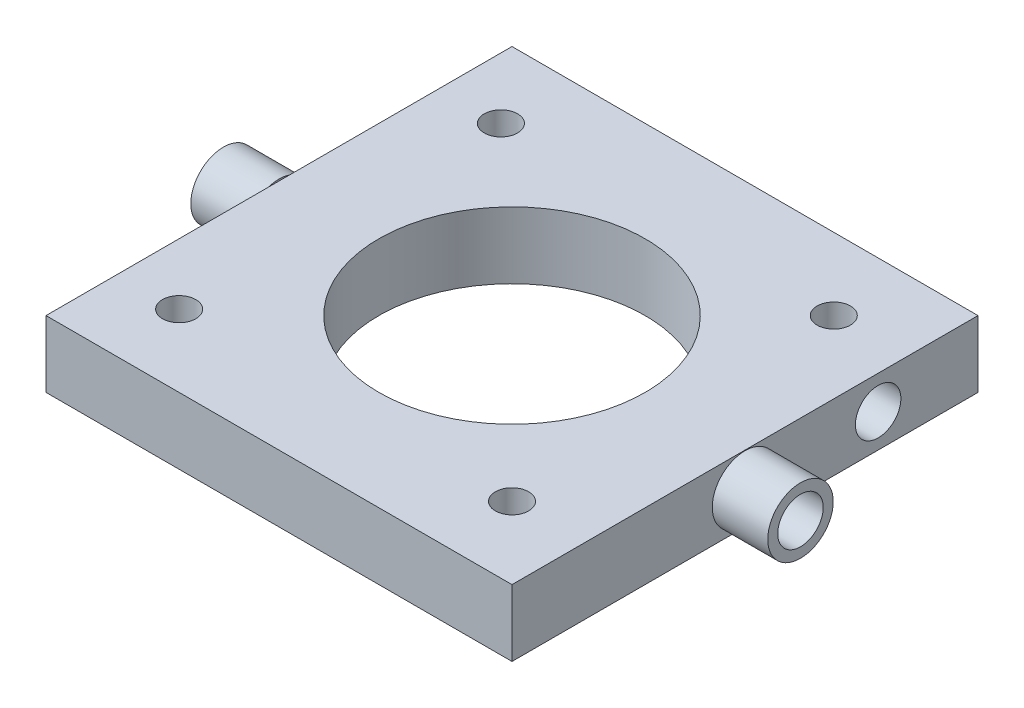
ISO-10303-21;
HEADER;
FILE_DESCRIPTION(('STEP AP214'),'2;1');
FILE_NAME('part.step','',(''),(''),'','','');
FILE_SCHEMA(('AUTOMOTIVE_DESIGN { 1 0 10303 214 1 1 1 1 }'));
ENDSEC;
DATA;
#1=APPLICATION_CONTEXT('core data for automotive mechanical design processes');
#2=APPLICATION_PROTOCOL_DEFINITION('international standard','automotive_design',2000,#1);
#3=PRODUCT_CONTEXT('',#1,'mechanical');
#4=PRODUCT('Part','Part','',(#3));
#5=PRODUCT_RELATED_PRODUCT_CATEGORY('part','',(#4));
#6=PRODUCT_DEFINITION_FORMATION('','',#4);
#7=PRODUCT_DEFINITION_CONTEXT('part definition',#1,'design');
#8=PRODUCT_DEFINITION('design','',#6,#7);
#9=PRODUCT_DEFINITION_SHAPE('','',#8);
#10=(LENGTH_UNIT() NAMED_UNIT(*) SI_UNIT(.MILLI.,.METRE.));
#11=(NAMED_UNIT(*) PLANE_ANGLE_UNIT() SI_UNIT($,.RADIAN.));
#12=(NAMED_UNIT(*) SI_UNIT($,.STERADIAN.) SOLID_ANGLE_UNIT());
#13=UNCERTAINTY_MEASURE_WITH_UNIT(LENGTH_MEASURE(1.E-05),#10,'distance_accuracy_value','');
#14=(GEOMETRIC_REPRESENTATION_CONTEXT(3) GLOBAL_UNCERTAINTY_ASSIGNED_CONTEXT((#13)) GLOBAL_UNIT_ASSIGNED_CONTEXT((#10,
#11,#12)) REPRESENTATION_CONTEXT('',''));
#15=CARTESIAN_POINT('',(0.,0.,0.));
#16=DIRECTION('',(0.,0.,1.));
#17=DIRECTION('',(1.,0.,0.));
#18=AXIS2_PLACEMENT_3D('',#15,#16,#17);
#19=CARTESIAN_POINT('',(21.,6.,21.));
#20=DIRECTION('',(-1.,0.,0.));
#21=DIRECTION('',(0.,0.,1.));
#22=AXIS2_PLACEMENT_3D('',#19,#20,#21);
#23=PLANE('',#22);
#24=DIRECTION('',(0.,0.,-1.));
#25=VECTOR('',#24,1.);
#26=CARTESIAN_POINT('',(21.,0.,21.));
#27=LINE('',#26,#25);
#28=CARTESIAN_POINT('',(21.,0.,21.));
#29=VERTEX_POINT('',#28);
#30=CARTESIAN_POINT('',(21.,0.,-21.));
#31=VERTEX_POINT('',#30);
#32=EDGE_CURVE('E166',#29,#31,#27,.T.);
#33=ORIENTED_EDGE('',*,*,#32,.T.);
#34=DIRECTION('',(0.,-1.,0.));
#35=VECTOR('',#34,1.);
#36=CARTESIAN_POINT('',(21.,6.,-21.));
#37=LINE('',#36,#35);
#38=CARTESIAN_POINT('',(21.,6.,-21.));
#39=VERTEX_POINT('',#38);
#40=EDGE_CURVE('E185',#39,#31,#37,.T.);
#41=ORIENTED_EDGE('',*,*,#40,.F.);
#42=DIRECTION('',(0.,0.,-1.));
#43=VECTOR('',#42,1.);
#44=CARTESIAN_POINT('',(21.,6.,21.));
#45=LINE('',#44,#43);
#46=CARTESIAN_POINT('',(21.,6.,21.));
#47=VERTEX_POINT('',#46);
#48=EDGE_CURVE('E169',#47,#39,#45,.T.);
#49=ORIENTED_EDGE('',*,*,#48,.F.);
#50=DIRECTION('',(0.,-1.,0.));
#51=VECTOR('',#50,1.);
#52=CARTESIAN_POINT('',(21.,6.,21.));
#53=LINE('',#52,#51);
#54=EDGE_CURVE('E173',#47,#29,#53,.T.);
#55=ORIENTED_EDGE('',*,*,#54,.T.);
#56=EDGE_LOOP('',(#33,#41,#49,#55));
#57=FACE_BOUND('',#56,.T.);
#58=CARTESIAN_POINT('',(21.,3.,-12.));
#59=DIRECTION('',(1.,0.,0.));
#60=DIRECTION('',(0.,0.,-1.));
#61=AXIS2_PLACEMENT_3D('',#58,#59,#60);
#62=CIRCLE('',#61,2.05);
#63=CARTESIAN_POINT('',(21.,3.,-14.05));
#64=VERTEX_POINT('',#63);
#65=EDGE_CURVE('E134',#64,#64,#62,.T.);
#66=ORIENTED_EDGE('',*,*,#65,.F.);
#67=EDGE_LOOP('',(#66));
#68=FACE_BOUND('',#67,.T.);
#69=CARTESIAN_POINT('',(21.,3.,0.));
#70=DIRECTION('',(-1.,0.,0.));
#71=DIRECTION('',(0.,0.,1.));
#72=AXIS2_PLACEMENT_3D('',#69,#70,#71);
#73=CIRCLE('',#72,2.95);
#74=CARTESIAN_POINT('',(21.,3.,2.94999999999999));
#75=VERTEX_POINT('',#74);
#76=EDGE_CURVE('E39',#75,#75,#73,.F.);
#77=ORIENTED_EDGE('',*,*,#76,.F.);
#78=EDGE_LOOP('',(#77));
#79=FACE_BOUND('',#78,.T.);
#80=ADVANCED_FACE('F36',(#57,#68,#79),#23,.F.);
#81=CARTESIAN_POINT('',(-21.,6.,-21.));
#82=DIRECTION('',(0.,0.,1.));
#83=DIRECTION('',(1.,0.,0.));
#84=AXIS2_PLACEMENT_3D('',#81,#82,#83);
#85=PLANE('',#84);
#86=DIRECTION('',(-1.,0.,0.));
#87=VECTOR('',#86,1.);
#88=CARTESIAN_POINT('',(-21.,0.,-21.));
#89=LINE('',#88,#87);
#90=CARTESIAN_POINT('',(-21.,0.,-21.));
#91=VERTEX_POINT('',#90);
#92=EDGE_CURVE('E176',#31,#91,#89,.T.);
#93=ORIENTED_EDGE('',*,*,#92,.T.);
#94=DIRECTION('',(0.,-1.,0.));
#95=VECTOR('',#94,1.);
#96=CARTESIAN_POINT('',(-21.,6.,-21.));
#97=LINE('',#96,#95);
#98=CARTESIAN_POINT('',(-21.,6.,-21.));
#99=VERTEX_POINT('',#98);
#100=EDGE_CURVE('E183',#99,#91,#97,.T.);
#101=ORIENTED_EDGE('',*,*,#100,.F.);
#102=DIRECTION('',(-1.,0.,0.));
#103=VECTOR('',#102,1.);
#104=CARTESIAN_POINT('',(-21.,6.,-21.));
#105=LINE('',#104,#103);
#106=EDGE_CURVE('E88',#39,#99,#105,.T.);
#107=ORIENTED_EDGE('',*,*,#106,.F.);
#108=ORIENTED_EDGE('',*,*,#40,.T.);
#109=EDGE_LOOP('',(#93,#101,#107,#108));
#110=FACE_BOUND('',#109,.T.);
#111=ADVANCED_FACE('F193',(#110),#85,.F.);
#112=CARTESIAN_POINT('',(-21.,6.,21.));
#113=DIRECTION('',(1.,0.,0.));
#114=DIRECTION('',(0.,0.,-1.));
#115=AXIS2_PLACEMENT_3D('',#112,#113,#114);
#116=PLANE('',#115);
#117=CARTESIAN_POINT('',(-21.,3.20690884142825,0.));
#118=DIRECTION('',(-1.,0.,0.));
#119=DIRECTION('',(0.,0.,1.));
#120=AXIS2_PLACEMENT_3D('',#117,#118,#119);
#121=CIRCLE('',#120,2.95);
#122=CARTESIAN_POINT('',(-21.,6.,-0.949284878162673));
#123=VERTEX_POINT('',#122);
#124=CARTESIAN_POINT('',(-21.,6.,0.949284878162649));
#125=VERTEX_POINT('',#124);
#126=EDGE_CURVE('E11',#123,#125,#121,.T.);
#127=ORIENTED_EDGE('',*,*,#126,.F.);
#128=DIRECTION('',(0.,0.,1.));
#129=VECTOR('',#128,1.);
#130=CARTESIAN_POINT('',(-21.,6.,21.));
#131=LINE('',#130,#129);
#132=EDGE_CURVE('E96',#99,#123,#131,.T.);
#133=ORIENTED_EDGE('',*,*,#132,.F.);
#134=ORIENTED_EDGE('',*,*,#100,.T.);
#135=DIRECTION('',(0.,0.,1.));
#136=VECTOR('',#135,1.);
#137=CARTESIAN_POINT('',(-21.,0.,21.));
#138=LINE('',#137,#136);
#139=CARTESIAN_POINT('',(-21.,0.,21.));
#140=VERTEX_POINT('',#139);
#141=EDGE_CURVE('E178',#91,#140,#138,.T.);
#142=ORIENTED_EDGE('',*,*,#141,.T.);
#143=DIRECTION('',(0.,-1.,0.));
#144=VECTOR('',#143,1.);
#145=CARTESIAN_POINT('',(-21.,6.,21.));
#146=LINE('',#145,#144);
#147=CARTESIAN_POINT('',(-21.,6.,21.));
#148=VERTEX_POINT('',#147);
#149=EDGE_CURVE('E103',#148,#140,#146,.T.);
#150=ORIENTED_EDGE('',*,*,#149,.F.);
#151=EDGE_CURVE('E94',#125,#148,#131,.T.);
#152=ORIENTED_EDGE('',*,*,#151,.F.);
#153=EDGE_LOOP('',(#127,#133,#134,#142,#150,#152));
#154=FACE_BOUND('',#153,.T.);
#155=CARTESIAN_POINT('',(-21.,3.20690884142825,-12.));
#156=DIRECTION('',(-1.,0.,0.));
#157=DIRECTION('',(0.,0.,1.));
#158=AXIS2_PLACEMENT_3D('',#155,#156,#157);
#159=CIRCLE('',#158,2.05);
#160=CARTESIAN_POINT('',(-21.,3.20690884142825,-9.95000000000001));
#161=VERTEX_POINT('',#160);
#162=EDGE_CURVE('E125',#161,#161,#159,.T.);
#163=ORIENTED_EDGE('',*,*,#162,.F.);
#164=EDGE_LOOP('',(#163));
#165=FACE_BOUND('',#164,.T.);
#166=ADVANCED_FACE('F101',(#154,#165),#116,.F.);
#167=CARTESIAN_POINT('',(-21.,6.,21.));
#168=DIRECTION('',(0.,0.,-1.));
#169=DIRECTION('',(-1.,0.,0.));
#170=AXIS2_PLACEMENT_3D('',#167,#168,#169);
#171=PLANE('',#170);
#172=DIRECTION('',(1.,0.,0.));
#173=VECTOR('',#172,1.);
#174=CARTESIAN_POINT('',(-21.,0.,21.));
#175=LINE('',#174,#173);
#176=EDGE_CURVE('E80',#140,#29,#175,.T.);
#177=ORIENTED_EDGE('',*,*,#176,.T.);
#178=ORIENTED_EDGE('',*,*,#54,.F.);
#179=DIRECTION('',(1.,0.,0.));
#180=VECTOR('',#179,1.);
#181=CARTESIAN_POINT('',(-21.,6.,21.));
#182=LINE('',#181,#180);
#183=EDGE_CURVE('E59',#148,#47,#182,.T.);
#184=ORIENTED_EDGE('',*,*,#183,.F.);
#185=ORIENTED_EDGE('',*,*,#149,.T.);
#186=EDGE_LOOP('',(#177,#178,#184,#185));
#187=FACE_BOUND('',#186,.T.);
#188=ADVANCED_FACE('F248',(#187),#171,.F.);
#189=CARTESIAN_POINT('',(0.,6.,0.));
#190=DIRECTION('',(0.,-1.,0.));
#191=DIRECTION('',(0.,0.,-1.));
#192=AXIS2_PLACEMENT_3D('',#189,#190,#191);
#193=PLANE('',#192);
#194=CARTESIAN_POINT('',(0.,6.,0.));
#195=DIRECTION('',(0.,1.,0.));
#196=DIRECTION('',(0.,0.,1.));
#197=AXIS2_PLACEMENT_3D('',#194,#195,#196);
#198=CIRCLE('',#197,12.);
#199=CARTESIAN_POINT('',(0.,6.,12.));
#200=VERTEX_POINT('',#199);
#201=EDGE_CURVE('E133',#200,#200,#198,.T.);
#202=ORIENTED_EDGE('',*,*,#201,.F.);
#203=EDGE_LOOP('',(#202));
#204=FACE_BOUND('',#203,.T.);
#205=CARTESIAN_POINT('',(-15.5000000000001,6.,-14.5));
#206=DIRECTION('',(0.,1.,0.));
#207=DIRECTION('',(0.,0.,1.));
#208=AXIS2_PLACEMENT_3D('',#205,#206,#207);
#209=CIRCLE('',#208,1.5);
#210=CARTESIAN_POINT('',(-15.5000000000001,6.,-13.));
#211=VERTEX_POINT('',#210);
#212=EDGE_CURVE('E155',#211,#211,#209,.T.);
#213=ORIENTED_EDGE('',*,*,#212,.F.);
#214=EDGE_LOOP('',(#213));
#215=FACE_BOUND('',#214,.T.);
#216=CARTESIAN_POINT('',(14.4999999999999,6.,-14.5));
#217=DIRECTION('',(0.,1.,0.));
#218=DIRECTION('',(0.,0.,1.));
#219=AXIS2_PLACEMENT_3D('',#216,#217,#218);
#220=CIRCLE('',#219,1.5);
#221=CARTESIAN_POINT('',(14.4999999999999,6.,-13.));
#222=VERTEX_POINT('',#221);
#223=EDGE_CURVE('E149',#222,#222,#220,.T.);
#224=ORIENTED_EDGE('',*,*,#223,.F.);
#225=EDGE_LOOP('',(#224));
#226=FACE_BOUND('',#225,.T.);
#227=CARTESIAN_POINT('',(14.5,6.,14.5));
#228=DIRECTION('',(0.,1.,0.));
#229=DIRECTION('',(0.,0.,1.));
#230=AXIS2_PLACEMENT_3D('',#227,#228,#229);
#231=CIRCLE('',#230,1.5);
#232=CARTESIAN_POINT('',(14.5,6.,16.));
#233=VERTEX_POINT('',#232);
#234=EDGE_CURVE('E143',#233,#233,#231,.T.);
#235=ORIENTED_EDGE('',*,*,#234,.F.);
#236=EDGE_LOOP('',(#235));
#237=FACE_BOUND('',#236,.T.);
#238=CARTESIAN_POINT('',(-15.5,6.,14.5));
#239=DIRECTION('',(0.,1.,0.));
#240=DIRECTION('',(0.,0.,1.));
#241=AXIS2_PLACEMENT_3D('',#238,#239,#240);
#242=CIRCLE('',#241,1.5);
#243=CARTESIAN_POINT('',(-15.5,6.,16.));
#244=VERTEX_POINT('',#243);
#245=EDGE_CURVE('E142',#244,#244,#242,.T.);
#246=ORIENTED_EDGE('',*,*,#245,.F.);
#247=EDGE_LOOP('',(#246));
#248=FACE_BOUND('',#247,.T.);
#249=ORIENTED_EDGE('',*,*,#48,.T.);
#250=ORIENTED_EDGE('',*,*,#106,.T.);
#251=ORIENTED_EDGE('',*,*,#132,.T.);
#252=EDGE_CURVE('E92',#123,#125,#131,.T.);
#253=ORIENTED_EDGE('',*,*,#252,.T.);
#254=ORIENTED_EDGE('',*,*,#151,.T.);
#255=ORIENTED_EDGE('',*,*,#183,.T.);
#256=EDGE_LOOP('',(#249,#250,#251,#253,#254,#255));
#257=FACE_BOUND('',#256,.T.);
#258=ADVANCED_FACE('F93',(#204,#215,#226,#237,#248,#257),#193,.F.);
#259=CARTESIAN_POINT('',(0.,0.,0.));
#260=DIRECTION('',(0.,-1.,0.));
#261=DIRECTION('',(0.,0.,-1.));
#262=AXIS2_PLACEMENT_3D('',#259,#260,#261);
#263=PLANE('',#262);
#264=CARTESIAN_POINT('',(0.,0.,0.));
#265=DIRECTION('',(0.,1.,0.));
#266=DIRECTION('',(0.,0.,1.));
#267=AXIS2_PLACEMENT_3D('',#264,#265,#266);
#268=CIRCLE('',#267,12.);
#269=CARTESIAN_POINT('',(0.,0.,12.));
#270=VERTEX_POINT('',#269);
#271=EDGE_CURVE('E158',#270,#270,#268,.T.);
#272=ORIENTED_EDGE('',*,*,#271,.T.);
#273=EDGE_LOOP('',(#272));
#274=FACE_BOUND('',#273,.T.);
#275=CARTESIAN_POINT('',(-15.5000000000001,0.,-14.5));
#276=DIRECTION('',(0.,1.,0.));
#277=DIRECTION('',(0.,0.,1.));
#278=AXIS2_PLACEMENT_3D('',#275,#276,#277);
#279=CIRCLE('',#278,1.5);
#280=CARTESIAN_POINT('',(-15.5000000000001,0.,-13.));
#281=VERTEX_POINT('',#280);
#282=EDGE_CURVE('E152',#281,#281,#279,.T.);
#283=ORIENTED_EDGE('',*,*,#282,.T.);
#284=EDGE_LOOP('',(#283));
#285=FACE_BOUND('',#284,.T.);
#286=CARTESIAN_POINT('',(14.4999999999999,0.,-14.5));
#287=DIRECTION('',(0.,1.,0.));
#288=DIRECTION('',(0.,0.,1.));
#289=AXIS2_PLACEMENT_3D('',#286,#287,#288);
#290=CIRCLE('',#289,1.5);
#291=CARTESIAN_POINT('',(14.4999999999999,0.,-13.));
#292=VERTEX_POINT('',#291);
#293=EDGE_CURVE('E146',#292,#292,#290,.T.);
#294=ORIENTED_EDGE('',*,*,#293,.T.);
#295=EDGE_LOOP('',(#294));
#296=FACE_BOUND('',#295,.T.);
#297=CARTESIAN_POINT('',(14.5,0.,14.5));
#298=DIRECTION('',(0.,1.,0.));
#299=DIRECTION('',(0.,0.,1.));
#300=AXIS2_PLACEMENT_3D('',#297,#298,#299);
#301=CIRCLE('',#300,1.5);
#302=CARTESIAN_POINT('',(14.5,0.,16.));
#303=VERTEX_POINT('',#302);
#304=EDGE_CURVE('E139',#303,#303,#301,.T.);
#305=ORIENTED_EDGE('',*,*,#304,.T.);
#306=EDGE_LOOP('',(#305));
#307=FACE_BOUND('',#306,.T.);
#308=CARTESIAN_POINT('',(-15.5,0.,14.5));
#309=DIRECTION('',(0.,1.,0.));
#310=DIRECTION('',(0.,0.,1.));
#311=AXIS2_PLACEMENT_3D('',#308,#309,#310);
#312=CIRCLE('',#311,1.5);
#313=CARTESIAN_POINT('',(-15.5,0.,16.));
#314=VERTEX_POINT('',#313);
#315=EDGE_CURVE('E163',#314,#314,#312,.T.);
#316=ORIENTED_EDGE('',*,*,#315,.T.);
#317=EDGE_LOOP('',(#316));
#318=FACE_BOUND('',#317,.T.);
#319=ORIENTED_EDGE('',*,*,#32,.F.);
#320=ORIENTED_EDGE('',*,*,#176,.F.);
#321=ORIENTED_EDGE('',*,*,#141,.F.);
#322=ORIENTED_EDGE('',*,*,#92,.F.);
#323=EDGE_LOOP('',(#319,#320,#321,#322));
#324=FACE_BOUND('',#323,.T.);
#325=ADVANCED_FACE('F244',(#274,#285,#296,#307,#318,#324),#263,.T.);
#326=CARTESIAN_POINT('',(-15.5,0.,14.5));
#327=DIRECTION('',(0.,1.,0.));
#328=DIRECTION('',(0.,0.,1.));
#329=AXIS2_PLACEMENT_3D('',#326,#327,#328);
#330=CYLINDRICAL_SURFACE('',#329,1.5);
#331=ORIENTED_EDGE('',*,*,#315,.F.);
#332=EDGE_LOOP('',(#331));
#333=FACE_BOUND('',#332,.T.);
#334=ORIENTED_EDGE('',*,*,#245,.T.);
#335=EDGE_LOOP('',(#334));
#336=FACE_BOUND('',#335,.T.);
#337=ADVANCED_FACE('F234',(#333,#336),#330,.F.);
#338=CARTESIAN_POINT('',(14.5,0.,14.5));
#339=DIRECTION('',(0.,1.,0.));
#340=DIRECTION('',(0.,0.,1.));
#341=AXIS2_PLACEMENT_3D('',#338,#339,#340);
#342=CYLINDRICAL_SURFACE('',#341,1.5);
#343=ORIENTED_EDGE('',*,*,#304,.F.);
#344=EDGE_LOOP('',(#343));
#345=FACE_BOUND('',#344,.T.);
#346=ORIENTED_EDGE('',*,*,#234,.T.);
#347=EDGE_LOOP('',(#346));
#348=FACE_BOUND('',#347,.T.);
#349=ADVANCED_FACE('F230',(#345,#348),#342,.F.);
#350=CARTESIAN_POINT('',(14.4999999999999,0.,-14.5));
#351=DIRECTION('',(0.,1.,0.));
#352=DIRECTION('',(0.,0.,1.));
#353=AXIS2_PLACEMENT_3D('',#350,#351,#352);
#354=CYLINDRICAL_SURFACE('',#353,1.5);
#355=ORIENTED_EDGE('',*,*,#293,.F.);
#356=EDGE_LOOP('',(#355));
#357=FACE_BOUND('',#356,.T.);
#358=ORIENTED_EDGE('',*,*,#223,.T.);
#359=EDGE_LOOP('',(#358));
#360=FACE_BOUND('',#359,.T.);
#361=ADVANCED_FACE('F233',(#357,#360),#354,.F.);
#362=CARTESIAN_POINT('',(-15.5000000000001,0.,-14.5));
#363=DIRECTION('',(0.,1.,0.));
#364=DIRECTION('',(0.,0.,1.));
#365=AXIS2_PLACEMENT_3D('',#362,#363,#364);
#366=CYLINDRICAL_SURFACE('',#365,1.5);
#367=ORIENTED_EDGE('',*,*,#282,.F.);
#368=EDGE_LOOP('',(#367));
#369=FACE_BOUND('',#368,.T.);
#370=ORIENTED_EDGE('',*,*,#212,.T.);
#371=EDGE_LOOP('',(#370));
#372=FACE_BOUND('',#371,.T.);
#373=ADVANCED_FACE('F215',(#369,#372),#366,.F.);
#374=CARTESIAN_POINT('',(0.,0.,0.));
#375=DIRECTION('',(0.,1.,0.));
#376=DIRECTION('',(0.,0.,1.));
#377=AXIS2_PLACEMENT_3D('',#374,#375,#376);
#378=CYLINDRICAL_SURFACE('',#377,12.);
#379=ORIENTED_EDGE('',*,*,#271,.F.);
#380=EDGE_LOOP('',(#379));
#381=FACE_BOUND('',#380,.T.);
#382=ORIENTED_EDGE('',*,*,#201,.T.);
#383=EDGE_LOOP('',(#382));
#384=FACE_BOUND('',#383,.T.);
#385=ADVANCED_FACE('F205',(#381,#384),#378,.F.);
#386=CARTESIAN_POINT('',(18.,3.,-12.));
#387=DIRECTION('',(1.,0.,0.));
#388=DIRECTION('',(0.,0.,-1.));
#389=AXIS2_PLACEMENT_3D('',#386,#387,#388);
#390=CYLINDRICAL_SURFACE('',#389,2.05);
#391=CARTESIAN_POINT('',(18.,3.,-12.));
#392=DIRECTION('',(1.,0.,0.));
#393=DIRECTION('',(0.,0.,-1.));
#394=AXIS2_PLACEMENT_3D('',#391,#392,#393);
#395=CIRCLE('',#394,2.05);
#396=CARTESIAN_POINT('',(18.,3.,-14.05));
#397=VERTEX_POINT('',#396);
#398=EDGE_CURVE('E130',#397,#397,#395,.T.);
#399=ORIENTED_EDGE('',*,*,#398,.F.);
#400=EDGE_LOOP('',(#399));
#401=FACE_BOUND('',#400,.T.);
#402=ORIENTED_EDGE('',*,*,#65,.T.);
#403=EDGE_LOOP('',(#402));
#404=FACE_BOUND('',#403,.T.);
#405=ADVANCED_FACE('F202',(#401,#404),#390,.F.);
#406=CARTESIAN_POINT('',(18.,3.,-12.));
#407=DIRECTION('',(1.,0.,0.));
#408=DIRECTION('',(0.,0.,-1.));
#409=AXIS2_PLACEMENT_3D('',#406,#407,#408);
#410=PLANE('',#409);
#411=ORIENTED_EDGE('',*,*,#398,.T.);
#412=EDGE_LOOP('',(#411));
#413=FACE_BOUND('',#412,.T.);
#414=ADVANCED_FACE('F204',(#413),#410,.T.);
#415=CARTESIAN_POINT('',(-18.,3.20690884142825,-12.));
#416=DIRECTION('',(-1.,0.,0.));
#417=DIRECTION('',(0.,0.,1.));
#418=AXIS2_PLACEMENT_3D('',#415,#416,#417);
#419=CYLINDRICAL_SURFACE('',#418,2.05);
#420=CARTESIAN_POINT('',(-18.,3.20690884142825,-12.));
#421=DIRECTION('',(-1.,0.,0.));
#422=DIRECTION('',(0.,0.,1.));
#423=AXIS2_PLACEMENT_3D('',#420,#421,#422);
#424=CIRCLE('',#423,2.05);
#425=CARTESIAN_POINT('',(-18.,3.20690884142825,-9.95000000000001));
#426=VERTEX_POINT('',#425);
#427=EDGE_CURVE('E121',#426,#426,#424,.T.);
#428=ORIENTED_EDGE('',*,*,#427,.F.);
#429=EDGE_LOOP('',(#428));
#430=FACE_BOUND('',#429,.T.);
#431=ORIENTED_EDGE('',*,*,#162,.T.);
#432=EDGE_LOOP('',(#431));
#433=FACE_BOUND('',#432,.T.);
#434=ADVANCED_FACE('F212',(#430,#433),#419,.F.);
#435=CARTESIAN_POINT('',(-18.,3.20690884142825,-12.));
#436=DIRECTION('',(-1.,0.,0.));
#437=DIRECTION('',(0.,0.,1.));
#438=AXIS2_PLACEMENT_3D('',#435,#436,#437);
#439=PLANE('',#438);
#440=ORIENTED_EDGE('',*,*,#427,.T.);
#441=EDGE_LOOP('',(#440));
#442=FACE_BOUND('',#441,.T.);
#443=ADVANCED_FACE('F335',(#442),#439,.T.);
#444=CARTESIAN_POINT('',(26.,3.,0.));
#445=DIRECTION('',(1.,0.,0.));
#446=DIRECTION('',(0.,0.,-1.));
#447=AXIS2_PLACEMENT_3D('',#444,#445,#446);
#448=PLANE('',#447);
#449=CARTESIAN_POINT('',(26.,3.,0.));
#450=DIRECTION('',(1.,0.,0.));
#451=DIRECTION('',(0.,0.,-1.));
#452=AXIS2_PLACEMENT_3D('',#449,#450,#451);
#453=CIRCLE('',#452,2.95);
#454=CARTESIAN_POINT('',(26.,3.,-2.95000000000001));
#455=VERTEX_POINT('',#454);
#456=EDGE_CURVE('E117',#455,#455,#453,.T.);
#457=ORIENTED_EDGE('',*,*,#456,.T.);
#458=EDGE_LOOP('',(#457));
#459=FACE_BOUND('',#458,.T.);
#460=CARTESIAN_POINT('',(26.,3.,0.));
#461=DIRECTION('',(1.,0.,0.));
#462=DIRECTION('',(0.,0.,-1.));
#463=AXIS2_PLACEMENT_3D('',#460,#461,#462);
#464=CIRCLE('',#463,2.05);
#465=CARTESIAN_POINT('',(26.,3.,-2.05000000000001));
#466=VERTEX_POINT('',#465);
#467=EDGE_CURVE('E110',#466,#466,#464,.T.);
#468=ORIENTED_EDGE('',*,*,#467,.F.);
#469=EDGE_LOOP('',(#468));
#470=FACE_BOUND('',#469,.T.);
#471=ADVANCED_FACE('F344',(#459,#470),#448,.T.);
#472=CARTESIAN_POINT('',(26.,3.,0.));
#473=DIRECTION('',(-1.,0.,0.));
#474=DIRECTION('',(0.,0.,1.));
#475=AXIS2_PLACEMENT_3D('',#472,#473,#474);
#476=CYLINDRICAL_SURFACE('',#475,2.95);
#477=ORIENTED_EDGE('',*,*,#456,.F.);
#478=EDGE_LOOP('',(#477));
#479=FACE_BOUND('',#478,.T.);
#480=ORIENTED_EDGE('',*,*,#76,.T.);
#481=EDGE_LOOP('',(#480));
#482=FACE_BOUND('',#481,.T.);
#483=ADVANCED_FACE('F190',(#479,#482),#476,.T.);
#484=CARTESIAN_POINT('',(18.,3.,0.));
#485=DIRECTION('',(1.,0.,0.));
#486=DIRECTION('',(0.,0.,-1.));
#487=AXIS2_PLACEMENT_3D('',#484,#485,#486);
#488=PLANE('',#487);
#489=CARTESIAN_POINT('',(18.,3.,0.));
#490=DIRECTION('',(1.,0.,0.));
#491=DIRECTION('',(0.,0.,-1.));
#492=AXIS2_PLACEMENT_3D('',#489,#490,#491);
#493=CIRCLE('',#492,2.05);
#494=CARTESIAN_POINT('',(18.,3.,-2.05000000000001));
#495=VERTEX_POINT('',#494);
#496=EDGE_CURVE('E124',#495,#495,#493,.T.);
#497=ORIENTED_EDGE('',*,*,#496,.T.);
#498=EDGE_LOOP('',(#497));
#499=FACE_BOUND('',#498,.T.);
#500=ADVANCED_FACE('F221',(#499),#488,.T.);
#501=CARTESIAN_POINT('',(18.,3.,0.));
#502=DIRECTION('',(1.,0.,0.));
#503=DIRECTION('',(0.,0.,-1.));
#504=AXIS2_PLACEMENT_3D('',#501,#502,#503);
#505=CYLINDRICAL_SURFACE('',#504,2.05);
#506=ORIENTED_EDGE('',*,*,#496,.F.);
#507=EDGE_LOOP('',(#506));
#508=FACE_BOUND('',#507,.T.);
#509=ORIENTED_EDGE('',*,*,#467,.T.);
#510=EDGE_LOOP('',(#509));
#511=FACE_BOUND('',#510,.T.);
#512=ADVANCED_FACE('F224',(#508,#511),#505,.F.);
#513=CARTESIAN_POINT('',(-26.,3.20690884142825,0.));
#514=DIRECTION('',(-1.,0.,0.));
#515=DIRECTION('',(0.,0.,1.));
#516=AXIS2_PLACEMENT_3D('',#513,#514,#515);
#517=PLANE('',#516);
#518=CARTESIAN_POINT('',(-26.,3.20690884142825,0.));
#519=DIRECTION('',(-1.,0.,0.));
#520=DIRECTION('',(0.,0.,1.));
#521=AXIS2_PLACEMENT_3D('',#518,#519,#520);
#522=CIRCLE('',#521,2.95);
#523=CARTESIAN_POINT('',(-26.,3.20690884142825,2.94999999999999));
#524=VERTEX_POINT('',#523);
#525=EDGE_CURVE('E107',#524,#524,#522,.T.);
#526=ORIENTED_EDGE('',*,*,#525,.T.);
#527=EDGE_LOOP('',(#526));
#528=FACE_BOUND('',#527,.T.);
#529=CARTESIAN_POINT('',(-26.,3.20690884142825,0.));
#530=DIRECTION('',(-1.,0.,0.));
#531=DIRECTION('',(0.,0.,1.));
#532=AXIS2_PLACEMENT_3D('',#529,#530,#531);
#533=CIRCLE('',#532,2.05);
#534=CARTESIAN_POINT('',(-26.,3.20690884142825,2.04999999999999));
#535=VERTEX_POINT('',#534);
#536=EDGE_CURVE('E108',#535,#535,#533,.T.);
#537=ORIENTED_EDGE('',*,*,#536,.F.);
#538=EDGE_LOOP('',(#537));
#539=FACE_BOUND('',#538,.T.);
#540=ADVANCED_FACE('F228',(#528,#539),#517,.T.);
#541=CARTESIAN_POINT('',(-21.,3.20690884142825,0.));
#542=DIRECTION('',(-1.,0.,0.));
#543=DIRECTION('',(0.,0.,1.));
#544=AXIS2_PLACEMENT_3D('',#541,#542,#543);
#545=PLANE('',#544);
#546=ORIENTED_EDGE('',*,*,#252,.F.);
#547=EDGE_CURVE('E45',#125,#123,#121,.T.);
#548=ORIENTED_EDGE('',*,*,#547,.F.);
#549=EDGE_LOOP('',(#546,#548));
#550=FACE_BOUND('',#549,.T.);
#551=ADVANCED_FACE('F106',(#550),#545,.F.);
#552=CARTESIAN_POINT('',(-26.,3.20690884142825,0.));
#553=DIRECTION('',(1.,0.,0.));
#554=DIRECTION('',(0.,0.,-1.));
#555=AXIS2_PLACEMENT_3D('',#552,#553,#554);
#556=CYLINDRICAL_SURFACE('',#555,2.95);
#557=ORIENTED_EDGE('',*,*,#525,.F.);
#558=EDGE_LOOP('',(#557));
#559=FACE_BOUND('',#558,.T.);
#560=ORIENTED_EDGE('',*,*,#547,.T.);
#561=ORIENTED_EDGE('',*,*,#126,.T.);
#562=EDGE_LOOP('',(#560,#561));
#563=FACE_BOUND('',#562,.T.);
#564=ADVANCED_FACE('F105',(#559,#563),#556,.T.);
#565=CARTESIAN_POINT('',(-18.,3.20690884142825,0.));
#566=DIRECTION('',(-1.,0.,0.));
#567=DIRECTION('',(0.,0.,1.));
#568=AXIS2_PLACEMENT_3D('',#565,#566,#567);
#569=PLANE('',#568);
#570=CARTESIAN_POINT('',(-18.,3.20690884142825,0.));
#571=DIRECTION('',(-1.,0.,0.));
#572=DIRECTION('',(0.,0.,1.));
#573=AXIS2_PLACEMENT_3D('',#570,#571,#572);
#574=CIRCLE('',#573,2.05);
#575=CARTESIAN_POINT('',(-18.,3.20690884142825,2.04999999999999));
#576=VERTEX_POINT('',#575);
#577=EDGE_CURVE('E120',#576,#576,#574,.T.);
#578=ORIENTED_EDGE('',*,*,#577,.T.);
#579=EDGE_LOOP('',(#578));
#580=FACE_BOUND('',#579,.T.);
#581=ADVANCED_FACE('F319',(#580),#569,.T.);
#582=CARTESIAN_POINT('',(-18.,3.20690884142825,0.));
#583=DIRECTION('',(-1.,0.,0.));
#584=DIRECTION('',(0.,0.,1.));
#585=AXIS2_PLACEMENT_3D('',#582,#583,#584);
#586=CYLINDRICAL_SURFACE('',#585,2.05);
#587=ORIENTED_EDGE('',*,*,#577,.F.);
#588=EDGE_LOOP('',(#587));
#589=FACE_BOUND('',#588,.T.);
#590=ORIENTED_EDGE('',*,*,#536,.T.);
#591=EDGE_LOOP('',(#590));
#592=FACE_BOUND('',#591,.T.);
#593=ADVANCED_FACE('F324',(#589,#592),#586,.F.);
#594=CLOSED_SHELL('',(#80,#111,#166,#188,#258,#325,#337,#349,#361,#373,#385,#405,#414,#434,#443,
#471,#483,#500,#512,#540,#551,#564,#581,#593));
#595=MANIFOLD_SOLID_BREP('B2',#594);
#596=ADVANCED_BREP_SHAPE_REPRESENTATION('',(#18,#595),#14);
#597=SHAPE_DEFINITION_REPRESENTATION(#9,#596);
ENDSEC;
END-ISO-10303-21;
